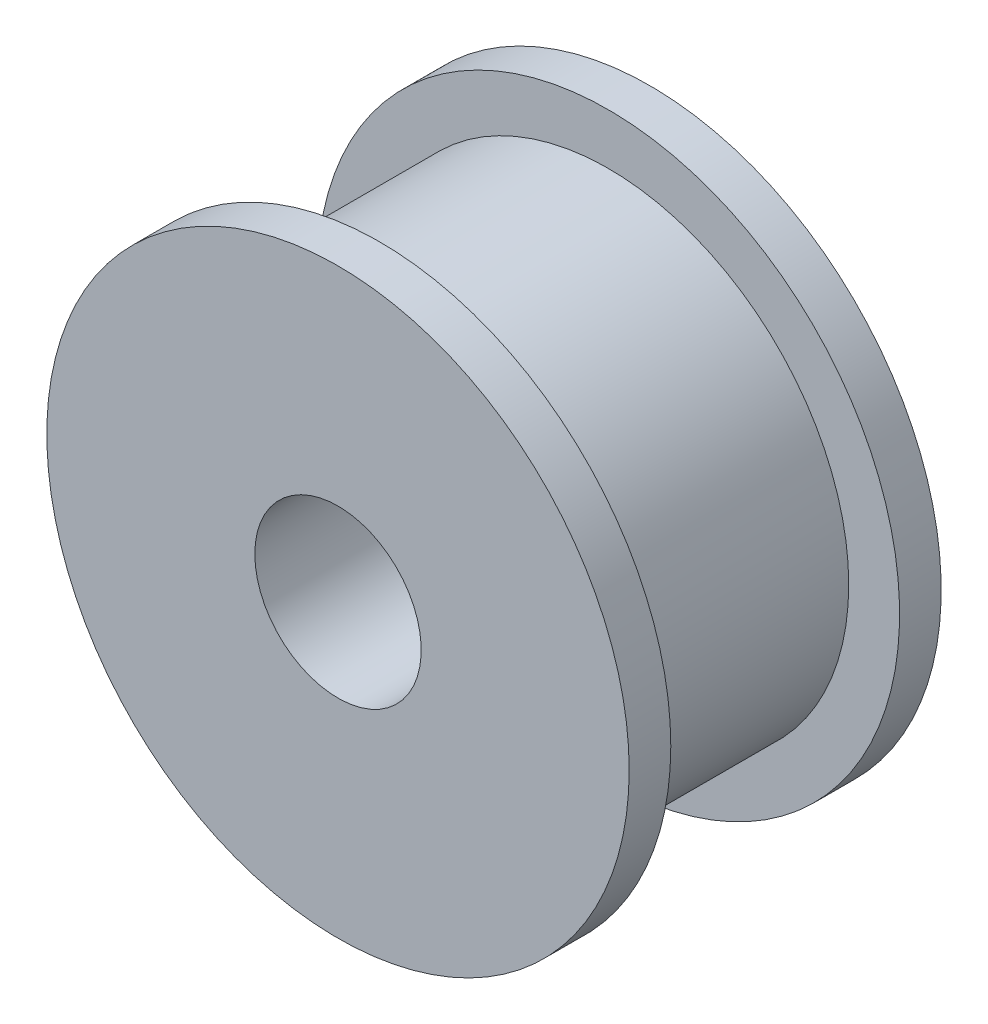
ISO-10303-21;
HEADER;
FILE_DESCRIPTION(('STEP AP214'),'2;1');
FILE_NAME('part.step','',(''),(''),'','','');
FILE_SCHEMA(('AUTOMOTIVE_DESIGN { 1 0 10303 214 1 1 1 1 }'));
ENDSEC;
DATA;
#1=APPLICATION_CONTEXT('core data for automotive mechanical design processes');
#2=APPLICATION_PROTOCOL_DEFINITION('international standard','automotive_design',2000,#1);
#3=PRODUCT_CONTEXT('',#1,'mechanical');
#4=PRODUCT('Part','Part','',(#3));
#5=PRODUCT_RELATED_PRODUCT_CATEGORY('part','',(#4));
#6=PRODUCT_DEFINITION_FORMATION('','',#4);
#7=PRODUCT_DEFINITION_CONTEXT('part definition',#1,'design');
#8=PRODUCT_DEFINITION('design','',#6,#7);
#9=PRODUCT_DEFINITION_SHAPE('','',#8);
#10=(LENGTH_UNIT() NAMED_UNIT(*) SI_UNIT(.MILLI.,.METRE.));
#11=(NAMED_UNIT(*) PLANE_ANGLE_UNIT() SI_UNIT($,.RADIAN.));
#12=(NAMED_UNIT(*) SI_UNIT($,.STERADIAN.) SOLID_ANGLE_UNIT());
#13=UNCERTAINTY_MEASURE_WITH_UNIT(LENGTH_MEASURE(1.E-05),#10,'distance_accuracy_value','');
#14=(GEOMETRIC_REPRESENTATION_CONTEXT(3) GLOBAL_UNCERTAINTY_ASSIGNED_CONTEXT((#13)) GLOBAL_UNIT_ASSIGNED_CONTEXT((#10,
#11,#12)) REPRESENTATION_CONTEXT('',''));
#15=CARTESIAN_POINT('',(0.,0.,0.));
#16=DIRECTION('',(0.,0.,1.));
#17=DIRECTION('',(1.,0.,0.));
#18=AXIS2_PLACEMENT_3D('',#15,#16,#17);
#19=CARTESIAN_POINT('',(0.,0.,11.));
#20=DIRECTION('',(0.,0.,-1.));
#21=DIRECTION('',(-1.,0.,0.));
#22=AXIS2_PLACEMENT_3D('',#19,#20,#21);
#23=CYLINDRICAL_SURFACE('',#22,11.555);
#24=CARTESIAN_POINT('',(0.,0.,11.));
#25=DIRECTION('',(0.,0.,1.));
#26=DIRECTION('',(1.,0.,0.));
#27=AXIS2_PLACEMENT_3D('',#24,#25,#26);
#28=CIRCLE('',#27,11.555);
#29=CARTESIAN_POINT('',(11.555,0.,11.));
#30=VERTEX_POINT('',#29);
#31=EDGE_CURVE('E10',#30,#30,#28,.T.);
#32=ORIENTED_EDGE('',*,*,#31,.F.);
#33=EDGE_LOOP('',(#32));
#34=FACE_BOUND('',#33,.T.);
#35=CARTESIAN_POINT('',(0.,0.,0.));
#36=DIRECTION('',(0.,0.,1.));
#37=DIRECTION('',(1.,0.,0.));
#38=AXIS2_PLACEMENT_3D('',#35,#36,#37);
#39=CIRCLE('',#38,11.555);
#40=CARTESIAN_POINT('',(11.555,0.,0.));
#41=VERTEX_POINT('',#40);
#42=EDGE_CURVE('E37',#41,#41,#39,.T.);
#43=ORIENTED_EDGE('',*,*,#42,.T.);
#44=EDGE_LOOP('',(#43));
#45=FACE_BOUND('',#44,.T.);
#46=ADVANCED_FACE('F40',(#34,#45),#23,.T.);
#47=CARTESIAN_POINT('',(0.,0.,13.));
#48=DIRECTION('',(0.,0.,-1.));
#49=DIRECTION('',(-1.,0.,0.));
#50=AXIS2_PLACEMENT_3D('',#47,#48,#49);
#51=CYLINDRICAL_SURFACE('',#50,14.);
#52=CARTESIAN_POINT('',(0.,0.,13.));
#53=DIRECTION('',(0.,0.,1.));
#54=DIRECTION('',(1.,0.,0.));
#55=AXIS2_PLACEMENT_3D('',#52,#53,#54);
#56=CIRCLE('',#55,14.);
#57=CARTESIAN_POINT('',(14.,0.,13.));
#58=VERTEX_POINT('',#57);
#59=EDGE_CURVE('E42',#58,#58,#56,.T.);
#60=ORIENTED_EDGE('',*,*,#59,.F.);
#61=EDGE_LOOP('',(#60));
#62=FACE_BOUND('',#61,.T.);
#63=CARTESIAN_POINT('',(0.,0.,11.));
#64=DIRECTION('',(0.,0.,1.));
#65=DIRECTION('',(1.,0.,0.));
#66=AXIS2_PLACEMENT_3D('',#63,#64,#65);
#67=CIRCLE('',#66,14.);
#68=CARTESIAN_POINT('',(14.,0.,11.));
#69=VERTEX_POINT('',#68);
#70=EDGE_CURVE('E48',#69,#69,#67,.T.);
#71=ORIENTED_EDGE('',*,*,#70,.T.);
#72=EDGE_LOOP('',(#71));
#73=FACE_BOUND('',#72,.T.);
#74=ADVANCED_FACE('F100',(#62,#73),#51,.T.);
#75=CARTESIAN_POINT('',(0.,0.,13.));
#76=DIRECTION('',(0.,0.,1.));
#77=DIRECTION('',(1.,0.,0.));
#78=AXIS2_PLACEMENT_3D('',#75,#76,#77);
#79=PLANE('',#78);
#80=CARTESIAN_POINT('',(0.,0.,13.));
#81=DIRECTION('',(0.,0.,-1.));
#82=DIRECTION('',(-1.,0.,0.));
#83=AXIS2_PLACEMENT_3D('',#80,#81,#82);
#84=CIRCLE('',#83,4.);
#85=CARTESIAN_POINT('',(-4.,0.,13.));
#86=VERTEX_POINT('',#85);
#87=EDGE_CURVE('E60',#86,#86,#84,.T.);
#88=ORIENTED_EDGE('',*,*,#87,.T.);
#89=EDGE_LOOP('',(#88));
#90=FACE_BOUND('',#89,.T.);
#91=ORIENTED_EDGE('',*,*,#59,.T.);
#92=EDGE_LOOP('',(#91));
#93=FACE_BOUND('',#92,.T.);
#94=ADVANCED_FACE('F66',(#90,#93),#79,.T.);
#95=CARTESIAN_POINT('',(0.,0.,11.));
#96=DIRECTION('',(0.,0.,1.));
#97=DIRECTION('',(1.,0.,0.));
#98=AXIS2_PLACEMENT_3D('',#95,#96,#97);
#99=PLANE('',#98);
#100=ORIENTED_EDGE('',*,*,#31,.T.);
#101=EDGE_LOOP('',(#100));
#102=FACE_BOUND('',#101,.T.);
#103=ORIENTED_EDGE('',*,*,#70,.F.);
#104=EDGE_LOOP('',(#103));
#105=FACE_BOUND('',#104,.T.);
#106=ADVANCED_FACE('F84',(#102,#105),#99,.F.);
#107=CARTESIAN_POINT('',(0.,0.,-2.));
#108=DIRECTION('',(0.,0.,1.));
#109=DIRECTION('',(1.,0.,0.));
#110=AXIS2_PLACEMENT_3D('',#107,#108,#109);
#111=CYLINDRICAL_SURFACE('',#110,14.);
#112=CARTESIAN_POINT('',(0.,0.,-2.));
#113=DIRECTION('',(0.,0.,-1.));
#114=DIRECTION('',(-1.,0.,0.));
#115=AXIS2_PLACEMENT_3D('',#112,#113,#114);
#116=CIRCLE('',#115,14.);
#117=CARTESIAN_POINT('',(-14.,0.,-2.));
#118=VERTEX_POINT('',#117);
#119=EDGE_CURVE('E57',#118,#118,#116,.T.);
#120=ORIENTED_EDGE('',*,*,#119,.F.);
#121=EDGE_LOOP('',(#120));
#122=FACE_BOUND('',#121,.T.);
#123=CARTESIAN_POINT('',(0.,0.,0.));
#124=DIRECTION('',(0.,0.,-1.));
#125=DIRECTION('',(-1.,0.,0.));
#126=AXIS2_PLACEMENT_3D('',#123,#124,#125);
#127=CIRCLE('',#126,14.);
#128=CARTESIAN_POINT('',(-14.,0.,0.));
#129=VERTEX_POINT('',#128);
#130=EDGE_CURVE('E52',#129,#129,#127,.T.);
#131=ORIENTED_EDGE('',*,*,#130,.T.);
#132=EDGE_LOOP('',(#131));
#133=FACE_BOUND('',#132,.T.);
#134=ADVANCED_FACE('F78',(#122,#133),#111,.T.);
#135=CARTESIAN_POINT('',(0.,0.,-2.));
#136=DIRECTION('',(0.,0.,-1.));
#137=DIRECTION('',(-1.,0.,0.));
#138=AXIS2_PLACEMENT_3D('',#135,#136,#137);
#139=PLANE('',#138);
#140=CARTESIAN_POINT('',(0.,0.,-2.));
#141=DIRECTION('',(0.,0.,-1.));
#142=DIRECTION('',(-1.,0.,0.));
#143=AXIS2_PLACEMENT_3D('',#140,#141,#142);
#144=CIRCLE('',#143,4.);
#145=CARTESIAN_POINT('',(-4.,0.,-2.));
#146=VERTEX_POINT('',#145);
#147=EDGE_CURVE('E58',#146,#146,#144,.T.);
#148=ORIENTED_EDGE('',*,*,#147,.F.);
#149=EDGE_LOOP('',(#148));
#150=FACE_BOUND('',#149,.T.);
#151=ORIENTED_EDGE('',*,*,#119,.T.);
#152=EDGE_LOOP('',(#151));
#153=FACE_BOUND('',#152,.T.);
#154=ADVANCED_FACE('F76',(#150,#153),#139,.T.);
#155=CARTESIAN_POINT('',(0.,0.,0.));
#156=DIRECTION('',(0.,0.,-1.));
#157=DIRECTION('',(-1.,0.,0.));
#158=AXIS2_PLACEMENT_3D('',#155,#156,#157);
#159=PLANE('',#158);
#160=ORIENTED_EDGE('',*,*,#42,.F.);
#161=EDGE_LOOP('',(#160));
#162=FACE_BOUND('',#161,.T.);
#163=ORIENTED_EDGE('',*,*,#130,.F.);
#164=EDGE_LOOP('',(#163));
#165=FACE_BOUND('',#164,.T.);
#166=ADVANCED_FACE('F75',(#162,#165),#159,.F.);
#167=CARTESIAN_POINT('',(0.,0.,13.));
#168=DIRECTION('',(0.,0.,-1.));
#169=DIRECTION('',(-1.,0.,0.));
#170=AXIS2_PLACEMENT_3D('',#167,#168,#169);
#171=CYLINDRICAL_SURFACE('',#170,4.);
#172=ORIENTED_EDGE('',*,*,#87,.F.);
#173=EDGE_LOOP('',(#172));
#174=FACE_BOUND('',#173,.T.);
#175=ORIENTED_EDGE('',*,*,#147,.T.);
#176=EDGE_LOOP('',(#175));
#177=FACE_BOUND('',#176,.T.);
#178=ADVANCED_FACE('F67',(#174,#177),#171,.F.);
#179=CLOSED_SHELL('',(#46,#74,#94,#106,#134,#154,#166,#178));
#180=MANIFOLD_SOLID_BREP('B2',#179);
#181=ADVANCED_BREP_SHAPE_REPRESENTATION('',(#18,#180),#14);
#182=SHAPE_DEFINITION_REPRESENTATION(#9,#181);
ENDSEC;
END-ISO-10303-21;
